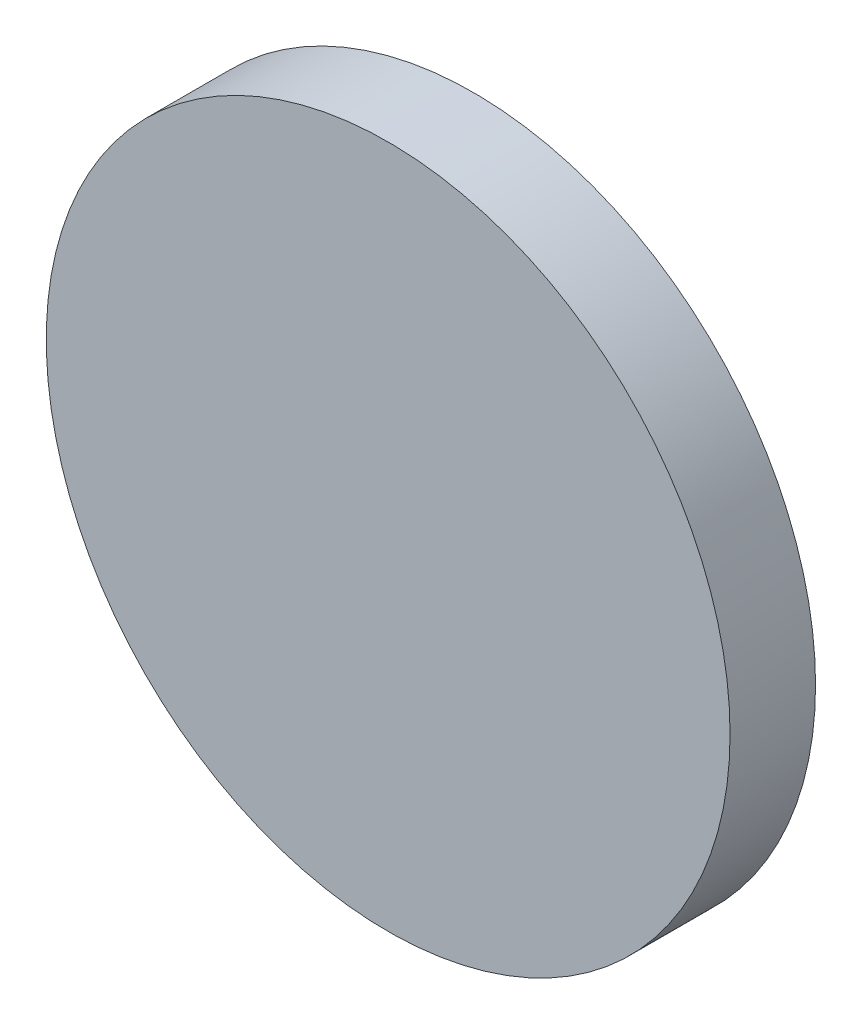
ISO-10303-21;
HEADER;
FILE_DESCRIPTION(('STEP AP214'),'2;1');
FILE_NAME('part.step','',(''),(''),'','','');
FILE_SCHEMA(('AUTOMOTIVE_DESIGN { 1 0 10303 214 1 1 1 1 }'));
ENDSEC;
DATA;
#1=APPLICATION_CONTEXT('core data for automotive mechanical design processes');
#2=APPLICATION_PROTOCOL_DEFINITION('international standard','automotive_design',2000,#1);
#3=PRODUCT_CONTEXT('',#1,'mechanical');
#4=PRODUCT('Part','Part','',(#3));
#5=PRODUCT_RELATED_PRODUCT_CATEGORY('part','',(#4));
#6=PRODUCT_DEFINITION_FORMATION('','',#4);
#7=PRODUCT_DEFINITION_CONTEXT('part definition',#1,'design');
#8=PRODUCT_DEFINITION('design','',#6,#7);
#9=PRODUCT_DEFINITION_SHAPE('','',#8);
#10=(LENGTH_UNIT() NAMED_UNIT(*) SI_UNIT(.MILLI.,.METRE.));
#11=(NAMED_UNIT(*) PLANE_ANGLE_UNIT() SI_UNIT($,.RADIAN.));
#12=(NAMED_UNIT(*) SI_UNIT($,.STERADIAN.) SOLID_ANGLE_UNIT());
#13=UNCERTAINTY_MEASURE_WITH_UNIT(LENGTH_MEASURE(1.E-05),#10,'distance_accuracy_value','');
#14=(GEOMETRIC_REPRESENTATION_CONTEXT(3) GLOBAL_UNCERTAINTY_ASSIGNED_CONTEXT((#13)) GLOBAL_UNIT_ASSIGNED_CONTEXT((#10,
#11,#12)) REPRESENTATION_CONTEXT('',''));
#15=CARTESIAN_POINT('',(0.,0.,0.));
#16=DIRECTION('',(0.,0.,1.));
#17=DIRECTION('',(1.,0.,0.));
#18=AXIS2_PLACEMENT_3D('',#15,#16,#17);
#19=CARTESIAN_POINT('',(0.,0.,2.5));
#20=DIRECTION('',(0.,0.,-1.));
#21=DIRECTION('',(-1.,0.,0.));
#22=AXIS2_PLACEMENT_3D('',#19,#20,#21);
#23=CYLINDRICAL_SURFACE('',#22,10.);
#24=CARTESIAN_POINT('',(0.,0.,2.5));
#25=DIRECTION('',(0.,0.,1.));
#26=DIRECTION('',(1.,0.,0.));
#27=AXIS2_PLACEMENT_3D('',#24,#25,#26);
#28=CIRCLE('',#27,10.);
#29=CARTESIAN_POINT('',(10.,0.,2.5));
#30=VERTEX_POINT('',#29);
#31=EDGE_CURVE('E40',#30,#30,#28,.T.);
#32=ORIENTED_EDGE('',*,*,#31,.F.);
#33=EDGE_LOOP('',(#32));
#34=FACE_BOUND('',#33,.T.);
#35=CARTESIAN_POINT('',(0.,0.,0.));
#36=DIRECTION('',(0.,0.,1.));
#37=DIRECTION('',(1.,0.,0.));
#38=AXIS2_PLACEMENT_3D('',#35,#36,#37);
#39=CIRCLE('',#38,10.);
#40=CARTESIAN_POINT('',(10.,0.,0.));
#41=VERTEX_POINT('',#40);
#42=EDGE_CURVE('E36',#41,#41,#39,.T.);
#43=ORIENTED_EDGE('',*,*,#42,.T.);
#44=EDGE_LOOP('',(#43));
#45=FACE_BOUND('',#44,.T.);
#46=ADVANCED_FACE('F33',(#34,#45),#23,.T.);
#47=CARTESIAN_POINT('',(0.,0.,2.5));
#48=DIRECTION('',(0.,0.,1.));
#49=DIRECTION('',(1.,0.,0.));
#50=AXIS2_PLACEMENT_3D('',#47,#48,#49);
#51=PLANE('',#50);
#52=ORIENTED_EDGE('',*,*,#31,.T.);
#53=EDGE_LOOP('',(#52));
#54=FACE_BOUND('',#53,.T.);
#55=ADVANCED_FACE('F57',(#54),#51,.T.);
#56=CARTESIAN_POINT('',(0.,0.,0.));
#57=DIRECTION('',(0.,0.,1.));
#58=DIRECTION('',(1.,0.,0.));
#59=AXIS2_PLACEMENT_3D('',#56,#57,#58);
#60=PLANE('',#59);
#61=CARTESIAN_POINT('',(0.,0.,0.));
#62=DIRECTION('',(0.,0.,-1.));
#63=DIRECTION('',(-1.,0.,0.));
#64=AXIS2_PLACEMENT_3D('',#61,#62,#63);
#65=CIRCLE('',#64,4.5);
#66=CARTESIAN_POINT('',(-4.5,0.,0.));
#67=VERTEX_POINT('',#66);
#68=EDGE_CURVE('E10',#67,#67,#65,.T.);
#69=ORIENTED_EDGE('',*,*,#68,.F.);
#70=EDGE_LOOP('',(#69));
#71=FACE_BOUND('',#70,.T.);
#72=ORIENTED_EDGE('',*,*,#42,.F.);
#73=EDGE_LOOP('',(#72));
#74=FACE_BOUND('',#73,.T.);
#75=ADVANCED_FACE('F54',(#71,#74),#60,.F.);
#76=CARTESIAN_POINT('',(0.,0.,-2.));
#77=DIRECTION('',(0.,0.,1.));
#78=DIRECTION('',(1.,0.,0.));
#79=AXIS2_PLACEMENT_3D('',#76,#77,#78);
#80=CYLINDRICAL_SURFACE('',#79,4.5);
#81=CARTESIAN_POINT('',(0.,0.,-2.));
#82=DIRECTION('',(0.,0.,-1.));
#83=DIRECTION('',(-1.,0.,0.));
#84=AXIS2_PLACEMENT_3D('',#81,#82,#83);
#85=CIRCLE('',#84,4.5);
#86=CARTESIAN_POINT('',(-4.5,0.,-2.));
#87=VERTEX_POINT('',#86);
#88=EDGE_CURVE('E46',#87,#87,#85,.T.);
#89=ORIENTED_EDGE('',*,*,#88,.F.);
#90=EDGE_LOOP('',(#89));
#91=FACE_BOUND('',#90,.T.);
#92=ORIENTED_EDGE('',*,*,#68,.T.);
#93=EDGE_LOOP('',(#92));
#94=FACE_BOUND('',#93,.T.);
#95=ADVANCED_FACE('F56',(#91,#94),#80,.T.);
#96=CARTESIAN_POINT('',(0.,0.,-2.));
#97=DIRECTION('',(0.,0.,-1.));
#98=DIRECTION('',(-1.,0.,0.));
#99=AXIS2_PLACEMENT_3D('',#96,#97,#98);
#100=PLANE('',#99);
#101=ORIENTED_EDGE('',*,*,#88,.T.);
#102=EDGE_LOOP('',(#101));
#103=FACE_BOUND('',#102,.T.);
#104=ADVANCED_FACE('F63',(#103),#100,.T.);
#105=CLOSED_SHELL('',(#46,#55,#75,#95,#104));
#106=MANIFOLD_SOLID_BREP('B2',#105);
#107=ADVANCED_BREP_SHAPE_REPRESENTATION('',(#18,#106),#14);
#108=SHAPE_DEFINITION_REPRESENTATION(#9,#107);
ENDSEC;
END-ISO-10303-21;
